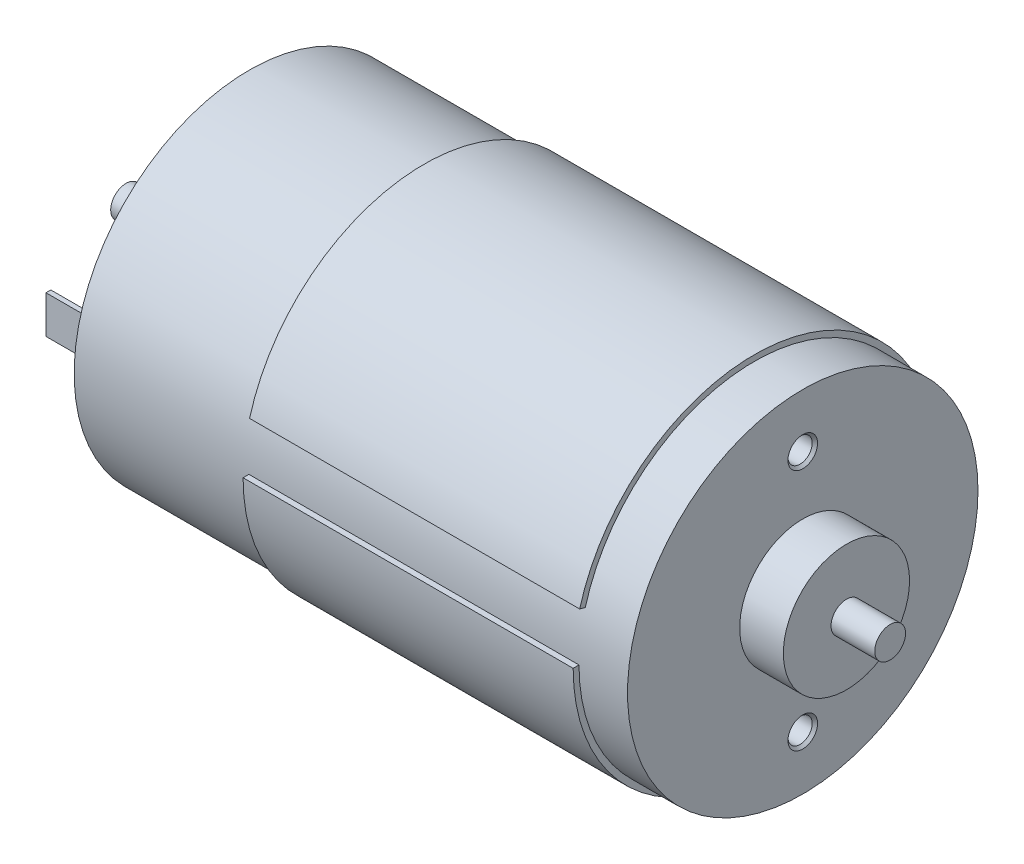
ISO-10303-21;
HEADER;
FILE_DESCRIPTION(('STEP AP214'),'2;1');
FILE_NAME('part.step','',(''),(''),'','','');
FILE_SCHEMA(('AUTOMOTIVE_DESIGN { 1 0 10303 214 1 1 1 1 }'));
ENDSEC;
DATA;
#1=APPLICATION_CONTEXT('core data for automotive mechanical design processes');
#2=APPLICATION_PROTOCOL_DEFINITION('international standard','automotive_design',2000,#1);
#3=PRODUCT_CONTEXT('',#1,'mechanical');
#4=PRODUCT('Part','Part','',(#3));
#5=PRODUCT_RELATED_PRODUCT_CATEGORY('part','',(#4));
#6=PRODUCT_DEFINITION_FORMATION('','',#4);
#7=PRODUCT_DEFINITION_CONTEXT('part definition',#1,'design');
#8=PRODUCT_DEFINITION('design','',#6,#7);
#9=PRODUCT_DEFINITION_SHAPE('','',#8);
#10=(LENGTH_UNIT() NAMED_UNIT(*) SI_UNIT(.MILLI.,.METRE.));
#11=(NAMED_UNIT(*) PLANE_ANGLE_UNIT() SI_UNIT($,.RADIAN.));
#12=(NAMED_UNIT(*) SI_UNIT($,.STERADIAN.) SOLID_ANGLE_UNIT());
#13=UNCERTAINTY_MEASURE_WITH_UNIT(LENGTH_MEASURE(1.E-05),#10,'distance_accuracy_value','');
#14=(GEOMETRIC_REPRESENTATION_CONTEXT(3) GLOBAL_UNCERTAINTY_ASSIGNED_CONTEXT((#13)) GLOBAL_UNIT_ASSIGNED_CONTEXT((#10,
#11,#12)) REPRESENTATION_CONTEXT('',''));
#15=CARTESIAN_POINT('',(0.,0.,0.));
#16=DIRECTION('',(0.,0.,1.));
#17=DIRECTION('',(1.,0.,0.));
#18=AXIS2_PLACEMENT_3D('',#15,#16,#17);
#19=CARTESIAN_POINT('',(66.,0.,0.));
#20=DIRECTION('',(1.,0.,0.));
#21=DIRECTION('',(0.,1.,0.));
#22=AXIS2_PLACEMENT_3D('',#19,#20,#21);
#23=PLANE('',#22);
#24=CARTESIAN_POINT('',(66.,0.,0.));
#25=DIRECTION('',(1.,0.,0.));
#26=DIRECTION('',(0.,0.,-1.));
#27=AXIS2_PLACEMENT_3D('',#24,#25,#26);
#28=CIRCLE('',#27,1.5875);
#29=CARTESIAN_POINT('',(66.,0.,-1.5875));
#30=VERTEX_POINT('',#29);
#31=EDGE_CURVE('E468',#30,#30,#28,.T.);
#32=ORIENTED_EDGE('',*,*,#31,.T.);
#33=EDGE_LOOP('',(#32));
#34=FACE_BOUND('',#33,.T.);
#35=ADVANCED_FACE('F18',(#34),#23,.T.);
#36=CARTESIAN_POINT('',(61.5,0.,0.));
#37=DIRECTION('',(1.,0.,0.));
#38=DIRECTION('',(0.,1.,0.));
#39=AXIS2_PLACEMENT_3D('',#36,#37,#38);
#40=PLANE('',#39);
#41=CARTESIAN_POINT('',(61.5,0.,0.));
#42=DIRECTION('',(1.,0.,0.));
#43=DIRECTION('',(0.,0.,-1.));
#44=AXIS2_PLACEMENT_3D('',#41,#42,#43);
#45=CIRCLE('',#44,1.5875);
#46=CARTESIAN_POINT('',(61.5,0.,-1.5875));
#47=VERTEX_POINT('',#46);
#48=EDGE_CURVE('E478',#47,#47,#45,.T.);
#49=ORIENTED_EDGE('',*,*,#48,.F.);
#50=EDGE_LOOP('',(#49));
#51=FACE_BOUND('',#50,.T.);
#52=CARTESIAN_POINT('',(61.5,0.,0.));
#53=DIRECTION('',(1.,0.,0.));
#54=DIRECTION('',(0.,0.,-1.));
#55=AXIS2_PLACEMENT_3D('',#52,#53,#54);
#56=CIRCLE('',#55,6.5);
#57=CARTESIAN_POINT('',(61.5,0.,-6.5));
#58=VERTEX_POINT('',#57);
#59=EDGE_CURVE('E250',#58,#58,#56,.T.);
#60=ORIENTED_EDGE('',*,*,#59,.T.);
#61=EDGE_LOOP('',(#60));
#62=FACE_BOUND('',#61,.T.);
#63=ADVANCED_FACE('F513',(#51,#62),#40,.T.);
#64=CARTESIAN_POINT('',(57.,0.,0.));
#65=DIRECTION('',(1.,0.,0.));
#66=DIRECTION('',(0.,1.,0.));
#67=AXIS2_PLACEMENT_3D('',#64,#65,#66);
#68=PLANE('',#67);
#69=CARTESIAN_POINT('',(57.,0.,0.));
#70=DIRECTION('',(1.,0.,0.));
#71=DIRECTION('',(0.,0.,-1.));
#72=AXIS2_PLACEMENT_3D('',#69,#70,#71);
#73=CIRCLE('',#72,6.5);
#74=CARTESIAN_POINT('',(57.,0.,-6.5));
#75=VERTEX_POINT('',#74);
#76=EDGE_CURVE('E240',#75,#75,#73,.T.);
#77=ORIENTED_EDGE('',*,*,#76,.F.);
#78=EDGE_LOOP('',(#77));
#79=FACE_BOUND('',#78,.T.);
#80=CARTESIAN_POINT('',(57.,-12.5,0.));
#81=DIRECTION('',(1.,0.,0.));
#82=DIRECTION('',(0.,0.,-1.));
#83=AXIS2_PLACEMENT_3D('',#80,#81,#82);
#84=CIRCLE('',#83,1.525);
#85=CARTESIAN_POINT('',(57.,-12.5,-1.525));
#86=VERTEX_POINT('',#85);
#87=EDGE_CURVE('E461',#86,#86,#84,.T.);
#88=ORIENTED_EDGE('',*,*,#87,.F.);
#89=EDGE_LOOP('',(#88));
#90=FACE_BOUND('',#89,.T.);
#91=CARTESIAN_POINT('',(57.,12.5,0.));
#92=DIRECTION('',(1.,0.,0.));
#93=DIRECTION('',(0.,0.,-1.));
#94=AXIS2_PLACEMENT_3D('',#91,#92,#93);
#95=CIRCLE('',#94,1.525);
#96=CARTESIAN_POINT('',(57.,12.5,-1.525));
#97=VERTEX_POINT('',#96);
#98=EDGE_CURVE('E676',#97,#97,#95,.T.);
#99=ORIENTED_EDGE('',*,*,#98,.F.);
#100=EDGE_LOOP('',(#99));
#101=FACE_BOUND('',#100,.T.);
#102=CARTESIAN_POINT('',(57.,0.,0.));
#103=DIRECTION('',(1.,0.,0.));
#104=DIRECTION('',(0.,0.,-1.));
#105=AXIS2_PLACEMENT_3D('',#102,#103,#104);
#106=CIRCLE('',#105,18.05);
#107=CARTESIAN_POINT('',(57.,0.,-18.05));
#108=VERTEX_POINT('',#107);
#109=EDGE_CURVE('E287',#108,#108,#106,.T.);
#110=ORIENTED_EDGE('',*,*,#109,.T.);
#111=EDGE_LOOP('',(#110));
#112=FACE_BOUND('',#111,.T.);
#113=ADVANCED_FACE('F504',(#79,#90,#101,#112),#68,.T.);
#114=CARTESIAN_POINT('',(52.,0.,0.));
#115=DIRECTION('',(-1.,0.,0.));
#116=DIRECTION('',(0.,0.,1.));
#117=AXIS2_PLACEMENT_3D('',#114,#115,#116);
#118=PLANE('',#117);
#119=CARTESIAN_POINT('',(52.,0.,0.));
#120=DIRECTION('',(1.,0.,0.));
#121=DIRECTION('',(0.,0.,1.));
#122=AXIS2_PLACEMENT_3D('',#119,#120,#121);
#123=CIRCLE('',#122,18.05);
#124=CARTESIAN_POINT('',(52.,0.,18.05));
#125=VERTEX_POINT('',#124);
#126=CARTESIAN_POINT('',(52.,4.79546789149172,17.4013214355023));
#127=VERTEX_POINT('',#126);
#128=EDGE_CURVE('E291',#125,#127,#123,.T.);
#129=ORIENTED_EDGE('',*,*,#128,.F.);
#130=DIRECTION('',(0.,0.,-1.));
#131=VECTOR('',#130,1.);
#132=CARTESIAN_POINT('',(52.,0.,18.05));
#133=LINE('',#132,#131);
#134=CARTESIAN_POINT('',(52.,0.,18.65));
#135=VERTEX_POINT('',#134);
#136=EDGE_CURVE('E28',#135,#125,#133,.T.);
#137=ORIENTED_EDGE('',*,*,#136,.F.);
#138=CARTESIAN_POINT('',(52.,0.,0.));
#139=DIRECTION('',(-1.,0.,0.));
#140=DIRECTION('',(0.,0.,1.));
#141=AXIS2_PLACEMENT_3D('',#138,#139,#140);
#142=CIRCLE('',#141,18.65);
#143=CARTESIAN_POINT('',(52.,4.95487402638895,17.9797587131368));
#144=VERTEX_POINT('',#143);
#145=EDGE_CURVE('E233',#144,#135,#142,.T.);
#146=ORIENTED_EDGE('',*,*,#145,.F.);
#147=DIRECTION('',(0.,0.265676891495387,0.964062129390709));
#148=VECTOR('',#147,1.);
#149=CARTESIAN_POINT('',(52.,4.79546789149172,17.4013214355023));
#150=LINE('',#149,#148);
#151=EDGE_CURVE('E262',#127,#144,#150,.T.);
#152=ORIENTED_EDGE('',*,*,#151,.F.);
#153=EDGE_LOOP('',(#129,#137,#146,#152));
#154=FACE_BOUND('',#153,.T.);
#155=ADVANCED_FACE('F502',(#154),#118,.F.);
#156=CARTESIAN_POINT('',(18.,0.,0.));
#157=DIRECTION('',(-1.,0.,0.));
#158=DIRECTION('',(0.,0.,1.));
#159=AXIS2_PLACEMENT_3D('',#156,#157,#158);
#160=PLANE('',#159);
#161=DIRECTION('',(0.,0.,-1.));
#162=VECTOR('',#161,1.);
#163=CARTESIAN_POINT('',(18.,0.,18.05));
#164=LINE('',#163,#162);
#165=CARTESIAN_POINT('',(18.,0.,18.65));
#166=VERTEX_POINT('',#165);
#167=CARTESIAN_POINT('',(18.,0.,18.05));
#168=VERTEX_POINT('',#167);
#169=EDGE_CURVE('E11',#166,#168,#164,.T.);
#170=ORIENTED_EDGE('',*,*,#169,.T.);
#171=CARTESIAN_POINT('',(18.,0.,0.));
#172=DIRECTION('',(1.,0.,0.));
#173=DIRECTION('',(0.,0.,1.));
#174=AXIS2_PLACEMENT_3D('',#171,#172,#173);
#175=CIRCLE('',#174,18.05);
#176=CARTESIAN_POINT('',(18.,4.79546789149172,17.4013214355023));
#177=VERTEX_POINT('',#176);
#178=EDGE_CURVE('E310',#168,#177,#175,.T.);
#179=ORIENTED_EDGE('',*,*,#178,.T.);
#180=DIRECTION('',(0.,0.265676891495387,0.964062129390709));
#181=VECTOR('',#180,1.);
#182=CARTESIAN_POINT('',(18.,4.79546789149172,17.4013214355023));
#183=LINE('',#182,#181);
#184=CARTESIAN_POINT('',(18.,4.95487402638895,17.9797587131368));
#185=VERTEX_POINT('',#184);
#186=EDGE_CURVE('E21',#177,#185,#183,.T.);
#187=ORIENTED_EDGE('',*,*,#186,.T.);
#188=CARTESIAN_POINT('',(18.,0.,0.));
#189=DIRECTION('',(-1.,0.,0.));
#190=DIRECTION('',(0.,0.,1.));
#191=AXIS2_PLACEMENT_3D('',#188,#189,#190);
#192=CIRCLE('',#191,18.65);
#193=EDGE_CURVE('E43',#185,#166,#192,.T.);
#194=ORIENTED_EDGE('',*,*,#193,.T.);
#195=EDGE_LOOP('',(#170,#179,#187,#194));
#196=FACE_BOUND('',#195,.T.);
#197=ADVANCED_FACE('F237',(#196),#160,.T.);
#198=CARTESIAN_POINT('',(18.,0.,18.05));
#199=DIRECTION('',(0.,-1.,0.));
#200=DIRECTION('',(0.,0.,-1.));
#201=AXIS2_PLACEMENT_3D('',#198,#199,#200);
#202=PLANE('',#201);
#203=ORIENTED_EDGE('',*,*,#136,.T.);
#204=DIRECTION('',(1.,0.,0.));
#205=VECTOR('',#204,1.);
#206=CARTESIAN_POINT('',(18.,0.,18.05));
#207=LINE('',#206,#205);
#208=EDGE_CURVE('E229',#168,#125,#207,.T.);
#209=ORIENTED_EDGE('',*,*,#208,.F.);
#210=ORIENTED_EDGE('',*,*,#169,.F.);
#211=DIRECTION('',(1.,0.,0.));
#212=VECTOR('',#211,1.);
#213=CARTESIAN_POINT('',(18.,0.,18.65));
#214=LINE('',#213,#212);
#215=EDGE_CURVE('E226',#166,#135,#214,.T.);
#216=ORIENTED_EDGE('',*,*,#215,.T.);
#217=EDGE_LOOP('',(#203,#209,#210,#216));
#218=FACE_BOUND('',#217,.T.);
#219=ADVANCED_FACE('F225',(#218),#202,.F.);
#220=CARTESIAN_POINT('',(18.,4.79546789149172,17.4013214355023));
#221=DIRECTION('',(0.,0.964062129390709,-0.265676891495387));
#222=DIRECTION('',(-1.,0.,0.));
#223=AXIS2_PLACEMENT_3D('',#220,#221,#222);
#224=PLANE('',#223);
#225=ORIENTED_EDGE('',*,*,#151,.T.);
#226=DIRECTION('',(1.,0.,0.));
#227=VECTOR('',#226,1.);
#228=CARTESIAN_POINT('',(18.,4.95487402638895,17.9797587131368));
#229=LINE('',#228,#227);
#230=EDGE_CURVE('E411',#185,#144,#229,.T.);
#231=ORIENTED_EDGE('',*,*,#230,.F.);
#232=ORIENTED_EDGE('',*,*,#186,.F.);
#233=DIRECTION('',(1.,0.,0.));
#234=VECTOR('',#233,1.);
#235=CARTESIAN_POINT('',(18.,4.79546789149172,17.4013214355023));
#236=LINE('',#235,#234);
#237=EDGE_CURVE('E302',#177,#127,#236,.T.);
#238=ORIENTED_EDGE('',*,*,#237,.T.);
#239=EDGE_LOOP('',(#225,#231,#232,#238));
#240=FACE_BOUND('',#239,.T.);
#241=ADVANCED_FACE('F500',(#240),#224,.F.);
#242=CARTESIAN_POINT('',(-6.7,0.,0.));
#243=DIRECTION('',(1.,0.,0.));
#244=DIRECTION('',(0.,1.,0.));
#245=AXIS2_PLACEMENT_3D('',#242,#243,#244);
#246=PLANE('',#245);
#247=DIRECTION('',(0.,1.,0.));
#248=VECTOR('',#247,1.);
#249=CARTESIAN_POINT('',(-6.7,-1.95,14.25));
#250=LINE('',#249,#248);
#251=CARTESIAN_POINT('',(-6.7,-1.95,14.25));
#252=VERTEX_POINT('',#251);
#253=CARTESIAN_POINT('',(-6.7,1.95,14.25));
#254=VERTEX_POINT('',#253);
#255=EDGE_CURVE('E372',#252,#254,#250,.T.);
#256=ORIENTED_EDGE('',*,*,#255,.T.);
#257=DIRECTION('',(0.,0.,-1.));
#258=VECTOR('',#257,1.);
#259=CARTESIAN_POINT('',(-6.7,1.95,13.75));
#260=LINE('',#259,#258);
#261=CARTESIAN_POINT('',(-6.7,1.95,13.75));
#262=VERTEX_POINT('',#261);
#263=EDGE_CURVE('E185',#254,#262,#260,.T.);
#264=ORIENTED_EDGE('',*,*,#263,.T.);
#265=DIRECTION('',(0.,-1.,0.));
#266=VECTOR('',#265,1.);
#267=CARTESIAN_POINT('',(-6.7,-1.95,13.75));
#268=LINE('',#267,#266);
#269=CARTESIAN_POINT('',(-6.7,-1.95,13.75));
#270=VERTEX_POINT('',#269);
#271=EDGE_CURVE('E263',#262,#270,#268,.T.);
#272=ORIENTED_EDGE('',*,*,#271,.T.);
#273=DIRECTION('',(0.,0.,1.));
#274=VECTOR('',#273,1.);
#275=CARTESIAN_POINT('',(-6.7,-1.95,13.75));
#276=LINE('',#275,#274);
#277=EDGE_CURVE('E196',#270,#252,#276,.T.);
#278=ORIENTED_EDGE('',*,*,#277,.T.);
#279=EDGE_LOOP('',(#256,#264,#272,#278));
#280=FACE_BOUND('',#279,.T.);
#281=ADVANCED_FACE('F639',(#280),#246,.F.);
#282=CARTESIAN_POINT('',(-6.7,-1.95,13.75));
#283=DIRECTION('',(0.,1.,0.));
#284=DIRECTION('',(1.,0.,0.));
#285=AXIS2_PLACEMENT_3D('',#282,#283,#284);
#286=PLANE('',#285);
#287=DIRECTION('',(0.,0.,1.));
#288=VECTOR('',#287,1.);
#289=CARTESIAN_POINT('',(0.3,-1.95,13.75));
#290=LINE('',#289,#288);
#291=CARTESIAN_POINT('',(0.3,-1.95,13.75));
#292=VERTEX_POINT('',#291);
#293=CARTESIAN_POINT('',(0.3,-1.95,14.25));
#294=VERTEX_POINT('',#293);
#295=EDGE_CURVE('E272',#292,#294,#290,.T.);
#296=ORIENTED_EDGE('',*,*,#295,.T.);
#297=DIRECTION('',(1.,0.,0.));
#298=VECTOR('',#297,1.);
#299=CARTESIAN_POINT('',(-6.7,-1.95,14.25));
#300=LINE('',#299,#298);
#301=EDGE_CURVE('E341',#252,#294,#300,.T.);
#302=ORIENTED_EDGE('',*,*,#301,.F.);
#303=ORIENTED_EDGE('',*,*,#277,.F.);
#304=DIRECTION('',(1.,0.,0.));
#305=VECTOR('',#304,1.);
#306=CARTESIAN_POINT('',(-6.7,-1.95,13.75));
#307=LINE('',#306,#305);
#308=EDGE_CURVE('E305',#270,#292,#307,.T.);
#309=ORIENTED_EDGE('',*,*,#308,.T.);
#310=EDGE_LOOP('',(#296,#302,#303,#309));
#311=FACE_BOUND('',#310,.T.);
#312=ADVANCED_FACE('F636',(#311),#286,.F.);
#313=CARTESIAN_POINT('',(-6.7,-1.95,13.75));
#314=DIRECTION('',(0.,0.,1.));
#315=DIRECTION('',(1.,0.,0.));
#316=AXIS2_PLACEMENT_3D('',#313,#314,#315);
#317=PLANE('',#316);
#318=DIRECTION('',(0.,-1.,0.));
#319=VECTOR('',#318,1.);
#320=CARTESIAN_POINT('',(0.3,-1.95,13.75));
#321=LINE('',#320,#319);
#322=CARTESIAN_POINT('',(0.3,1.95,13.75));
#323=VERTEX_POINT('',#322);
#324=EDGE_CURVE('E267',#323,#292,#321,.T.);
#325=ORIENTED_EDGE('',*,*,#324,.T.);
#326=ORIENTED_EDGE('',*,*,#308,.F.);
#327=ORIENTED_EDGE('',*,*,#271,.F.);
#328=DIRECTION('',(1.,0.,0.));
#329=VECTOR('',#328,1.);
#330=CARTESIAN_POINT('',(-6.7,1.95,13.75));
#331=LINE('',#330,#329);
#332=EDGE_CURVE('E306',#262,#323,#331,.T.);
#333=ORIENTED_EDGE('',*,*,#332,.T.);
#334=EDGE_LOOP('',(#325,#326,#327,#333));
#335=FACE_BOUND('',#334,.T.);
#336=ADVANCED_FACE('F633',(#335),#317,.F.);
#337=CARTESIAN_POINT('',(-6.7,1.95,13.75));
#338=DIRECTION('',(0.,-1.,0.));
#339=DIRECTION('',(0.,0.,-1.));
#340=AXIS2_PLACEMENT_3D('',#337,#338,#339);
#341=PLANE('',#340);
#342=DIRECTION('',(0.,0.,-1.));
#343=VECTOR('',#342,1.);
#344=CARTESIAN_POINT('',(0.3,1.95,13.75));
#345=LINE('',#344,#343);
#346=CARTESIAN_POINT('',(0.3,1.95,14.25));
#347=VERTEX_POINT('',#346);
#348=EDGE_CURVE('E271',#347,#323,#345,.T.);
#349=ORIENTED_EDGE('',*,*,#348,.T.);
#350=ORIENTED_EDGE('',*,*,#332,.F.);
#351=ORIENTED_EDGE('',*,*,#263,.F.);
#352=DIRECTION('',(1.,0.,0.));
#353=VECTOR('',#352,1.);
#354=CARTESIAN_POINT('',(-6.7,1.95,14.25));
#355=LINE('',#354,#353);
#356=EDGE_CURVE('E326',#254,#347,#355,.T.);
#357=ORIENTED_EDGE('',*,*,#356,.T.);
#358=EDGE_LOOP('',(#349,#350,#351,#357));
#359=FACE_BOUND('',#358,.T.);
#360=ADVANCED_FACE('F615',(#359),#341,.F.);
#361=CARTESIAN_POINT('',(-6.7,-1.95,14.25));
#362=DIRECTION('',(0.,0.,-1.));
#363=DIRECTION('',(0.,-1.,0.));
#364=AXIS2_PLACEMENT_3D('',#361,#362,#363);
#365=PLANE('',#364);
#366=DIRECTION('',(0.,1.,0.));
#367=VECTOR('',#366,1.);
#368=CARTESIAN_POINT('',(0.3,-1.95,14.25));
#369=LINE('',#368,#367);
#370=EDGE_CURVE('E355',#294,#347,#369,.T.);
#371=ORIENTED_EDGE('',*,*,#370,.T.);
#372=ORIENTED_EDGE('',*,*,#356,.F.);
#373=ORIENTED_EDGE('',*,*,#255,.F.);
#374=ORIENTED_EDGE('',*,*,#301,.T.);
#375=EDGE_LOOP('',(#371,#372,#373,#374));
#376=FACE_BOUND('',#375,.T.);
#377=ADVANCED_FACE('F611',(#376),#365,.F.);
#378=CARTESIAN_POINT('',(-6.7,0.,0.));
#379=DIRECTION('',(1.,0.,0.));
#380=DIRECTION('',(0.,1.,0.));
#381=AXIS2_PLACEMENT_3D('',#378,#379,#380);
#382=PLANE('',#381);
#383=DIRECTION('',(0.,1.,0.));
#384=VECTOR('',#383,1.);
#385=CARTESIAN_POINT('',(-6.7,-1.95,-13.75));
#386=LINE('',#385,#384);
#387=CARTESIAN_POINT('',(-6.7,-1.95,-13.75));
#388=VERTEX_POINT('',#387);
#389=CARTESIAN_POINT('',(-6.7,1.95,-13.75));
#390=VERTEX_POINT('',#389);
#391=EDGE_CURVE('E426',#388,#390,#386,.T.);
#392=ORIENTED_EDGE('',*,*,#391,.T.);
#393=DIRECTION('',(0.,0.,-1.));
#394=VECTOR('',#393,1.);
#395=CARTESIAN_POINT('',(-6.7,1.95,-14.25));
#396=LINE('',#395,#394);
#397=CARTESIAN_POINT('',(-6.7,1.95,-14.25));
#398=VERTEX_POINT('',#397);
#399=EDGE_CURVE('E436',#390,#398,#396,.T.);
#400=ORIENTED_EDGE('',*,*,#399,.T.);
#401=DIRECTION('',(0.,-1.,0.));
#402=VECTOR('',#401,1.);
#403=CARTESIAN_POINT('',(-6.7,-1.95,-14.25));
#404=LINE('',#403,#402);
#405=CARTESIAN_POINT('',(-6.7,-1.95,-14.25));
#406=VERTEX_POINT('',#405);
#407=EDGE_CURVE('E327',#398,#406,#404,.T.);
#408=ORIENTED_EDGE('',*,*,#407,.T.);
#409=DIRECTION('',(0.,0.,1.));
#410=VECTOR('',#409,1.);
#411=CARTESIAN_POINT('',(-6.7,-1.95,-14.25));
#412=LINE('',#411,#410);
#413=EDGE_CURVE('E323',#406,#388,#412,.T.);
#414=ORIENTED_EDGE('',*,*,#413,.T.);
#415=EDGE_LOOP('',(#392,#400,#408,#414));
#416=FACE_BOUND('',#415,.T.);
#417=ADVANCED_FACE('F614',(#416),#382,.F.);
#418=CARTESIAN_POINT('',(-6.7,-1.95,-14.25));
#419=DIRECTION('',(0.,1.,0.));
#420=DIRECTION('',(1.,0.,0.));
#421=AXIS2_PLACEMENT_3D('',#418,#419,#420);
#422=PLANE('',#421);
#423=DIRECTION('',(0.,0.,1.));
#424=VECTOR('',#423,1.);
#425=CARTESIAN_POINT('',(0.3,-1.95,-14.25));
#426=LINE('',#425,#424);
#427=CARTESIAN_POINT('',(0.3,-1.95,-14.25));
#428=VERTEX_POINT('',#427);
#429=CARTESIAN_POINT('',(0.3,-1.95,-13.75));
#430=VERTEX_POINT('',#429);
#431=EDGE_CURVE('E317',#428,#430,#426,.T.);
#432=ORIENTED_EDGE('',*,*,#431,.T.);
#433=DIRECTION('',(1.,0.,0.));
#434=VECTOR('',#433,1.);
#435=CARTESIAN_POINT('',(-6.7,-1.95,-13.75));
#436=LINE('',#435,#434);
#437=EDGE_CURVE('E430',#388,#430,#436,.T.);
#438=ORIENTED_EDGE('',*,*,#437,.F.);
#439=ORIENTED_EDGE('',*,*,#413,.F.);
#440=DIRECTION('',(1.,0.,0.));
#441=VECTOR('',#440,1.);
#442=CARTESIAN_POINT('',(-6.7,-1.95,-14.25));
#443=LINE('',#442,#441);
#444=EDGE_CURVE('E345',#406,#428,#443,.T.);
#445=ORIENTED_EDGE('',*,*,#444,.T.);
#446=EDGE_LOOP('',(#432,#438,#439,#445));
#447=FACE_BOUND('',#446,.T.);
#448=ADVANCED_FACE('F623',(#447),#422,.F.);
#449=CARTESIAN_POINT('',(-6.7,-1.95,-14.25));
#450=DIRECTION('',(0.,0.,1.));
#451=DIRECTION('',(1.,0.,0.));
#452=AXIS2_PLACEMENT_3D('',#449,#450,#451);
#453=PLANE('',#452);
#454=DIRECTION('',(0.,-1.,0.));
#455=VECTOR('',#454,1.);
#456=CARTESIAN_POINT('',(0.3,-1.95,-14.25));
#457=LINE('',#456,#455);
#458=CARTESIAN_POINT('',(0.3,1.95,-14.25));
#459=VERTEX_POINT('',#458);
#460=EDGE_CURVE('E298',#459,#428,#457,.T.);
#461=ORIENTED_EDGE('',*,*,#460,.T.);
#462=ORIENTED_EDGE('',*,*,#444,.F.);
#463=ORIENTED_EDGE('',*,*,#407,.F.);
#464=DIRECTION('',(1.,0.,0.));
#465=VECTOR('',#464,1.);
#466=CARTESIAN_POINT('',(-6.7,1.95,-14.25));
#467=LINE('',#466,#465);
#468=EDGE_CURVE('E433',#398,#459,#467,.T.);
#469=ORIENTED_EDGE('',*,*,#468,.T.);
#470=EDGE_LOOP('',(#461,#462,#463,#469));
#471=FACE_BOUND('',#470,.T.);
#472=ADVANCED_FACE('F619',(#471),#453,.F.);
#473=CARTESIAN_POINT('',(-6.7,1.95,-14.25));
#474=DIRECTION('',(0.,-1.,0.));
#475=DIRECTION('',(0.,0.,-1.));
#476=AXIS2_PLACEMENT_3D('',#473,#474,#475);
#477=PLANE('',#476);
#478=DIRECTION('',(0.,0.,-1.));
#479=VECTOR('',#478,1.);
#480=CARTESIAN_POINT('',(0.3,1.95,-14.25));
#481=LINE('',#480,#479);
#482=CARTESIAN_POINT('',(0.3,1.95,-13.75));
#483=VERTEX_POINT('',#482);
#484=EDGE_CURVE('E293',#483,#459,#481,.T.);
#485=ORIENTED_EDGE('',*,*,#484,.T.);
#486=ORIENTED_EDGE('',*,*,#468,.F.);
#487=ORIENTED_EDGE('',*,*,#399,.F.);
#488=DIRECTION('',(1.,0.,0.));
#489=VECTOR('',#488,1.);
#490=CARTESIAN_POINT('',(-6.7,1.95,-13.75));
#491=LINE('',#490,#489);
#492=EDGE_CURVE('E423',#390,#483,#491,.T.);
#493=ORIENTED_EDGE('',*,*,#492,.T.);
#494=EDGE_LOOP('',(#485,#486,#487,#493));
#495=FACE_BOUND('',#494,.T.);
#496=ADVANCED_FACE('F609',(#495),#477,.F.);
#497=CARTESIAN_POINT('',(-6.7,-1.95,-13.75));
#498=DIRECTION('',(0.,0.,-1.));
#499=DIRECTION('',(0.,-1.,0.));
#500=AXIS2_PLACEMENT_3D('',#497,#498,#499);
#501=PLANE('',#500);
#502=DIRECTION('',(0.,1.,0.));
#503=VECTOR('',#502,1.);
#504=CARTESIAN_POINT('',(0.3,-1.95,-13.75));
#505=LINE('',#504,#503);
#506=EDGE_CURVE('E383',#430,#483,#505,.T.);
#507=ORIENTED_EDGE('',*,*,#506,.T.);
#508=ORIENTED_EDGE('',*,*,#492,.F.);
#509=ORIENTED_EDGE('',*,*,#391,.F.);
#510=ORIENTED_EDGE('',*,*,#437,.T.);
#511=EDGE_LOOP('',(#507,#508,#509,#510));
#512=FACE_BOUND('',#511,.T.);
#513=ADVANCED_FACE('F606',(#512),#501,.F.);
#514=CARTESIAN_POINT('',(0.3,-3.075,12.575));
#515=DIRECTION('',(0.,1.,0.));
#516=DIRECTION('',(1.,0.,0.));
#517=AXIS2_PLACEMENT_3D('',#514,#515,#516);
#518=PLANE('',#517);
#519=DIRECTION('',(0.,0.,1.));
#520=VECTOR('',#519,1.);
#521=CARTESIAN_POINT('',(1.3,-3.075,12.575));
#522=LINE('',#521,#520);
#523=CARTESIAN_POINT('',(1.3,-3.075,12.575));
#524=VERTEX_POINT('',#523);
#525=CARTESIAN_POINT('',(1.3,-3.075,15.425));
#526=VERTEX_POINT('',#525);
#527=EDGE_CURVE('E351',#524,#526,#522,.T.);
#528=ORIENTED_EDGE('',*,*,#527,.T.);
#529=DIRECTION('',(1.,0.,0.));
#530=VECTOR('',#529,1.);
#531=CARTESIAN_POINT('',(0.3,-3.075,15.425));
#532=LINE('',#531,#530);
#533=CARTESIAN_POINT('',(0.3,-3.075,15.425));
#534=VERTEX_POINT('',#533);
#535=EDGE_CURVE('E330',#534,#526,#532,.T.);
#536=ORIENTED_EDGE('',*,*,#535,.F.);
#537=DIRECTION('',(0.,0.,1.));
#538=VECTOR('',#537,1.);
#539=CARTESIAN_POINT('',(0.3,-3.075,12.575));
#540=LINE('',#539,#538);
#541=CARTESIAN_POINT('',(0.3,-3.075,12.575));
#542=VERTEX_POINT('',#541);
#543=EDGE_CURVE('E338',#542,#534,#540,.T.);
#544=ORIENTED_EDGE('',*,*,#543,.F.);
#545=DIRECTION('',(1.,0.,0.));
#546=VECTOR('',#545,1.);
#547=CARTESIAN_POINT('',(0.3,-3.075,12.575));
#548=LINE('',#547,#546);
#549=EDGE_CURVE('E420',#542,#524,#548,.T.);
#550=ORIENTED_EDGE('',*,*,#549,.T.);
#551=EDGE_LOOP('',(#528,#536,#544,#550));
#552=FACE_BOUND('',#551,.T.);
#553=ADVANCED_FACE('F586',(#552),#518,.F.);
#554=CARTESIAN_POINT('',(0.3,-3.075,12.575));
#555=DIRECTION('',(0.,0.,1.));
#556=DIRECTION('',(1.,0.,0.));
#557=AXIS2_PLACEMENT_3D('',#554,#555,#556);
#558=PLANE('',#557);
#559=DIRECTION('',(0.,-1.,0.));
#560=VECTOR('',#559,1.);
#561=CARTESIAN_POINT('',(1.3,-3.075,12.575));
#562=LINE('',#561,#560);
#563=CARTESIAN_POINT('',(1.3,3.075,12.575));
#564=VERTEX_POINT('',#563);
#565=EDGE_CURVE('E346',#564,#524,#562,.T.);
#566=ORIENTED_EDGE('',*,*,#565,.T.);
#567=ORIENTED_EDGE('',*,*,#549,.F.);
#568=DIRECTION('',(0.,-1.,0.));
#569=VECTOR('',#568,1.);
#570=CARTESIAN_POINT('',(0.3,-3.075,12.575));
#571=LINE('',#570,#569);
#572=CARTESIAN_POINT('',(0.3,3.075,12.575));
#573=VERTEX_POINT('',#572);
#574=EDGE_CURVE('E334',#573,#542,#571,.T.);
#575=ORIENTED_EDGE('',*,*,#574,.F.);
#576=DIRECTION('',(1.,0.,0.));
#577=VECTOR('',#576,1.);
#578=CARTESIAN_POINT('',(0.3,3.075,12.575));
#579=LINE('',#578,#577);
#580=EDGE_CURVE('E416',#573,#564,#579,.T.);
#581=ORIENTED_EDGE('',*,*,#580,.T.);
#582=EDGE_LOOP('',(#566,#567,#575,#581));
#583=FACE_BOUND('',#582,.T.);
#584=ADVANCED_FACE('F582',(#583),#558,.F.);
#585=CARTESIAN_POINT('',(0.3,3.075,12.575));
#586=DIRECTION('',(0.,-1.,0.));
#587=DIRECTION('',(0.,0.,-1.));
#588=AXIS2_PLACEMENT_3D('',#585,#586,#587);
#589=PLANE('',#588);
#590=DIRECTION('',(0.,0.,-1.));
#591=VECTOR('',#590,1.);
#592=CARTESIAN_POINT('',(1.3,3.075,12.575));
#593=LINE('',#592,#591);
#594=CARTESIAN_POINT('',(1.3,3.075,15.425));
#595=VERTEX_POINT('',#594);
#596=EDGE_CURVE('E367',#595,#564,#593,.T.);
#597=ORIENTED_EDGE('',*,*,#596,.T.);
#598=ORIENTED_EDGE('',*,*,#580,.F.);
#599=DIRECTION('',(0.,0.,-1.));
#600=VECTOR('',#599,1.);
#601=CARTESIAN_POINT('',(0.3,3.075,12.575));
#602=LINE('',#601,#600);
#603=CARTESIAN_POINT('',(0.3,3.075,15.425));
#604=VERTEX_POINT('',#603);
#605=EDGE_CURVE('E258',#604,#573,#602,.T.);
#606=ORIENTED_EDGE('',*,*,#605,.F.);
#607=DIRECTION('',(1.,0.,0.));
#608=VECTOR('',#607,1.);
#609=CARTESIAN_POINT('',(0.3,3.075,15.425));
#610=LINE('',#609,#608);
#611=EDGE_CURVE('E276',#604,#595,#610,.T.);
#612=ORIENTED_EDGE('',*,*,#611,.T.);
#613=EDGE_LOOP('',(#597,#598,#606,#612));
#614=FACE_BOUND('',#613,.T.);
#615=ADVANCED_FACE('F585',(#614),#589,.F.);
#616=CARTESIAN_POINT('',(0.3,-3.075,15.425));
#617=DIRECTION('',(0.,0.,-1.));
#618=DIRECTION('',(0.,-1.,0.));
#619=AXIS2_PLACEMENT_3D('',#616,#617,#618);
#620=PLANE('',#619);
#621=DIRECTION('',(0.,1.,0.));
#622=VECTOR('',#621,1.);
#623=CARTESIAN_POINT('',(1.3,-3.075,15.425));
#624=LINE('',#623,#622);
#625=EDGE_CURVE('E363',#526,#595,#624,.T.);
#626=ORIENTED_EDGE('',*,*,#625,.T.);
#627=ORIENTED_EDGE('',*,*,#611,.F.);
#628=DIRECTION('',(0.,1.,0.));
#629=VECTOR('',#628,1.);
#630=CARTESIAN_POINT('',(0.3,-3.075,15.425));
#631=LINE('',#630,#629);
#632=EDGE_CURVE('E255',#534,#604,#631,.T.);
#633=ORIENTED_EDGE('',*,*,#632,.F.);
#634=ORIENTED_EDGE('',*,*,#535,.T.);
#635=EDGE_LOOP('',(#626,#627,#633,#634));
#636=FACE_BOUND('',#635,.T.);
#637=ADVANCED_FACE('F598',(#636),#620,.F.);
#638=CARTESIAN_POINT('',(0.3,-3.075,-15.425));
#639=DIRECTION('',(0.,1.,0.));
#640=DIRECTION('',(1.,0.,0.));
#641=AXIS2_PLACEMENT_3D('',#638,#639,#640);
#642=PLANE('',#641);
#643=DIRECTION('',(0.,0.,1.));
#644=VECTOR('',#643,1.);
#645=CARTESIAN_POINT('',(1.3,-3.075,-15.425));
#646=LINE('',#645,#644);
#647=CARTESIAN_POINT('',(1.3,-3.075,-15.425));
#648=VERTEX_POINT('',#647);
#649=CARTESIAN_POINT('',(1.3,-3.075,-12.575));
#650=VERTEX_POINT('',#649);
#651=EDGE_CURVE('E391',#648,#650,#646,.T.);
#652=ORIENTED_EDGE('',*,*,#651,.T.);
#653=DIRECTION('',(1.,0.,0.));
#654=VECTOR('',#653,1.);
#655=CARTESIAN_POINT('',(0.3,-3.075,-12.575));
#656=LINE('',#655,#654);
#657=CARTESIAN_POINT('',(0.3,-3.075,-12.575));
#658=VERTEX_POINT('',#657);
#659=EDGE_CURVE('E405',#658,#650,#656,.T.);
#660=ORIENTED_EDGE('',*,*,#659,.F.);
#661=DIRECTION('',(0.,0.,1.));
#662=VECTOR('',#661,1.);
#663=CARTESIAN_POINT('',(0.3,-3.075,-15.425));
#664=LINE('',#663,#662);
#665=CARTESIAN_POINT('',(0.3,-3.075,-15.425));
#666=VERTEX_POINT('',#665);
#667=EDGE_CURVE('E379',#666,#658,#664,.T.);
#668=ORIENTED_EDGE('',*,*,#667,.F.);
#669=DIRECTION('',(1.,0.,0.));
#670=VECTOR('',#669,1.);
#671=CARTESIAN_POINT('',(0.3,-3.075,-15.425));
#672=LINE('',#671,#670);
#673=EDGE_CURVE('E273',#666,#648,#672,.T.);
#674=ORIENTED_EDGE('',*,*,#673,.T.);
#675=EDGE_LOOP('',(#652,#660,#668,#674));
#676=FACE_BOUND('',#675,.T.);
#677=ADVANCED_FACE('F594',(#676),#642,.F.);
#678=CARTESIAN_POINT('',(0.3,-3.075,-15.425));
#679=DIRECTION('',(0.,0.,1.));
#680=DIRECTION('',(1.,0.,0.));
#681=AXIS2_PLACEMENT_3D('',#678,#679,#680);
#682=PLANE('',#681);
#683=DIRECTION('',(0.,-1.,0.));
#684=VECTOR('',#683,1.);
#685=CARTESIAN_POINT('',(1.3,-3.075,-15.425));
#686=LINE('',#685,#684);
#687=CARTESIAN_POINT('',(1.3,3.075,-15.425));
#688=VERTEX_POINT('',#687);
#689=EDGE_CURVE('E395',#688,#648,#686,.T.);
#690=ORIENTED_EDGE('',*,*,#689,.T.);
#691=ORIENTED_EDGE('',*,*,#673,.F.);
#692=DIRECTION('',(0.,-1.,0.));
#693=VECTOR('',#692,1.);
#694=CARTESIAN_POINT('',(0.3,-3.075,-15.425));
#695=LINE('',#694,#693);
#696=CARTESIAN_POINT('',(0.3,3.075,-15.425));
#697=VERTEX_POINT('',#696);
#698=EDGE_CURVE('E378',#697,#666,#695,.T.);
#699=ORIENTED_EDGE('',*,*,#698,.F.);
#700=DIRECTION('',(1.,0.,0.));
#701=VECTOR('',#700,1.);
#702=CARTESIAN_POINT('',(0.3,3.075,-15.425));
#703=LINE('',#702,#701);
#704=EDGE_CURVE('E277',#697,#688,#703,.T.);
#705=ORIENTED_EDGE('',*,*,#704,.T.);
#706=EDGE_LOOP('',(#690,#691,#699,#705));
#707=FACE_BOUND('',#706,.T.);
#708=ADVANCED_FACE('F590',(#707),#682,.F.);
#709=CARTESIAN_POINT('',(0.3,3.075,-15.425));
#710=DIRECTION('',(0.,-1.,0.));
#711=DIRECTION('',(0.,0.,-1.));
#712=AXIS2_PLACEMENT_3D('',#709,#710,#711);
#713=PLANE('',#712);
#714=DIRECTION('',(0.,0.,-1.));
#715=VECTOR('',#714,1.);
#716=CARTESIAN_POINT('',(1.3,3.075,-15.425));
#717=LINE('',#716,#715);
#718=CARTESIAN_POINT('',(1.3,3.075,-12.575));
#719=VERTEX_POINT('',#718);
#720=EDGE_CURVE('E297',#719,#688,#717,.T.);
#721=ORIENTED_EDGE('',*,*,#720,.T.);
#722=ORIENTED_EDGE('',*,*,#704,.F.);
#723=DIRECTION('',(0.,0.,-1.));
#724=VECTOR('',#723,1.);
#725=CARTESIAN_POINT('',(0.3,3.075,-15.425));
#726=LINE('',#725,#724);
#727=CARTESIAN_POINT('',(0.3,3.075,-12.575));
#728=VERTEX_POINT('',#727);
#729=EDGE_CURVE('E371',#728,#697,#726,.T.);
#730=ORIENTED_EDGE('',*,*,#729,.F.);
#731=DIRECTION('',(1.,0.,0.));
#732=VECTOR('',#731,1.);
#733=CARTESIAN_POINT('',(0.3,3.075,-12.575));
#734=LINE('',#733,#732);
#735=EDGE_CURVE('E350',#728,#719,#734,.T.);
#736=ORIENTED_EDGE('',*,*,#735,.T.);
#737=EDGE_LOOP('',(#721,#722,#730,#736));
#738=FACE_BOUND('',#737,.T.);
#739=ADVANCED_FACE('F580',(#738),#713,.F.);
#740=CARTESIAN_POINT('',(0.3,-3.075,-12.575));
#741=DIRECTION('',(0.,0.,-1.));
#742=DIRECTION('',(0.,-1.,0.));
#743=AXIS2_PLACEMENT_3D('',#740,#741,#742);
#744=PLANE('',#743);
#745=DIRECTION('',(0.,1.,0.));
#746=VECTOR('',#745,1.);
#747=CARTESIAN_POINT('',(1.3,-3.075,-12.575));
#748=LINE('',#747,#746);
#749=EDGE_CURVE('E387',#650,#719,#748,.T.);
#750=ORIENTED_EDGE('',*,*,#749,.T.);
#751=ORIENTED_EDGE('',*,*,#735,.F.);
#752=DIRECTION('',(0.,1.,0.));
#753=VECTOR('',#752,1.);
#754=CARTESIAN_POINT('',(0.3,-3.075,-12.575));
#755=LINE('',#754,#753);
#756=EDGE_CURVE('E362',#658,#728,#755,.T.);
#757=ORIENTED_EDGE('',*,*,#756,.F.);
#758=ORIENTED_EDGE('',*,*,#659,.T.);
#759=EDGE_LOOP('',(#750,#751,#757,#758));
#760=FACE_BOUND('',#759,.T.);
#761=ADVANCED_FACE('F576',(#760),#744,.F.);
#762=CARTESIAN_POINT('',(-12.7,0.,0.));
#763=DIRECTION('',(-1.,0.,0.));
#764=DIRECTION('',(0.,0.,1.));
#765=AXIS2_PLACEMENT_3D('',#762,#763,#764);
#766=PLANE('',#765);
#767=CARTESIAN_POINT('',(-12.7,0.,0.));
#768=DIRECTION('',(-1.,0.,0.));
#769=DIRECTION('',(0.,0.,1.));
#770=AXIS2_PLACEMENT_3D('',#767,#768,#769);
#771=CIRCLE('',#770,1.5875);
#772=CARTESIAN_POINT('',(-12.7,0.,1.5875));
#773=VERTEX_POINT('',#772);
#774=EDGE_CURVE('E235',#773,#773,#771,.T.);
#775=ORIENTED_EDGE('',*,*,#774,.T.);
#776=EDGE_LOOP('',(#775));
#777=FACE_BOUND('',#776,.T.);
#778=ADVANCED_FACE('F571',(#777),#766,.T.);
#779=CARTESIAN_POINT('',(-2.7,0.,0.));
#780=DIRECTION('',(-1.,0.,0.));
#781=DIRECTION('',(0.,0.,1.));
#782=AXIS2_PLACEMENT_3D('',#779,#780,#781);
#783=PLANE('',#782);
#784=CARTESIAN_POINT('',(-2.7,0.,0.));
#785=DIRECTION('',(-1.,0.,0.));
#786=DIRECTION('',(0.,0.,1.));
#787=AXIS2_PLACEMENT_3D('',#784,#785,#786);
#788=CIRCLE('',#787,1.5875);
#789=CARTESIAN_POINT('',(-2.7,0.,1.5875));
#790=VERTEX_POINT('',#789);
#791=EDGE_CURVE('E254',#790,#790,#788,.T.);
#792=ORIENTED_EDGE('',*,*,#791,.F.);
#793=EDGE_LOOP('',(#792));
#794=FACE_BOUND('',#793,.T.);
#795=CARTESIAN_POINT('',(-2.7,0.,0.));
#796=DIRECTION('',(-1.,0.,0.));
#797=DIRECTION('',(0.,0.,1.));
#798=AXIS2_PLACEMENT_3D('',#795,#796,#797);
#799=CIRCLE('',#798,6.45);
#800=CARTESIAN_POINT('',(-2.7,0.,6.45));
#801=VERTEX_POINT('',#800);
#802=EDGE_CURVE('E278',#801,#801,#799,.T.);
#803=ORIENTED_EDGE('',*,*,#802,.T.);
#804=EDGE_LOOP('',(#803));
#805=FACE_BOUND('',#804,.T.);
#806=ADVANCED_FACE('F568',(#794,#805),#783,.T.);
#807=CARTESIAN_POINT('',(0.,0.,0.));
#808=DIRECTION('',(1.,0.,0.));
#809=DIRECTION('',(0.,1.,0.));
#810=AXIS2_PLACEMENT_3D('',#807,#808,#809);
#811=PLANE('',#810);
#812=CARTESIAN_POINT('',(0.,0.,0.));
#813=DIRECTION('',(-1.,0.,0.));
#814=DIRECTION('',(0.,0.,1.));
#815=AXIS2_PLACEMENT_3D('',#812,#813,#814);
#816=CIRCLE('',#815,17.35);
#817=CARTESIAN_POINT('',(0.,0.,17.35));
#818=VERTEX_POINT('',#817);
#819=EDGE_CURVE('E292',#818,#818,#816,.T.);
#820=ORIENTED_EDGE('',*,*,#819,.F.);
#821=EDGE_LOOP('',(#820));
#822=FACE_BOUND('',#821,.T.);
#823=CARTESIAN_POINT('',(0.,0.,0.));
#824=DIRECTION('',(1.,0.,0.));
#825=DIRECTION('',(0.,0.,-1.));
#826=AXIS2_PLACEMENT_3D('',#823,#824,#825);
#827=CIRCLE('',#826,18.05);
#828=CARTESIAN_POINT('',(0.,0.,-18.05));
#829=VERTEX_POINT('',#828);
#830=EDGE_CURVE('E313',#829,#829,#827,.T.);
#831=ORIENTED_EDGE('',*,*,#830,.F.);
#832=EDGE_LOOP('',(#831));
#833=FACE_BOUND('',#832,.T.);
#834=ADVANCED_FACE('F564',(#822,#833),#811,.F.);
#835=CARTESIAN_POINT('',(1.3,0.,0.));
#836=DIRECTION('',(-1.,0.,0.));
#837=DIRECTION('',(0.,0.,1.));
#838=AXIS2_PLACEMENT_3D('',#835,#836,#837);
#839=PLANE('',#838);
#840=ORIENTED_EDGE('',*,*,#596,.F.);
#841=ORIENTED_EDGE('',*,*,#625,.F.);
#842=ORIENTED_EDGE('',*,*,#527,.F.);
#843=ORIENTED_EDGE('',*,*,#565,.F.);
#844=EDGE_LOOP('',(#840,#841,#842,#843));
#845=FACE_BOUND('',#844,.T.);
#846=ORIENTED_EDGE('',*,*,#720,.F.);
#847=ORIENTED_EDGE('',*,*,#749,.F.);
#848=ORIENTED_EDGE('',*,*,#651,.F.);
#849=ORIENTED_EDGE('',*,*,#689,.F.);
#850=EDGE_LOOP('',(#846,#847,#848,#849));
#851=FACE_BOUND('',#850,.T.);
#852=CARTESIAN_POINT('',(1.3,0.,0.));
#853=DIRECTION('',(-1.,0.,0.));
#854=DIRECTION('',(0.,0.,1.));
#855=AXIS2_PLACEMENT_3D('',#852,#853,#854);
#856=CIRCLE('',#855,6.45);
#857=CARTESIAN_POINT('',(1.3,0.,6.45));
#858=VERTEX_POINT('',#857);
#859=EDGE_CURVE('E282',#858,#858,#856,.T.);
#860=ORIENTED_EDGE('',*,*,#859,.F.);
#861=EDGE_LOOP('',(#860));
#862=FACE_BOUND('',#861,.T.);
#863=CARTESIAN_POINT('',(1.3,0.,0.));
#864=DIRECTION('',(-1.,0.,0.));
#865=DIRECTION('',(0.,0.,1.));
#866=AXIS2_PLACEMENT_3D('',#863,#864,#865);
#867=CIRCLE('',#866,17.35);
#868=CARTESIAN_POINT('',(1.3,0.,17.35));
#869=VERTEX_POINT('',#868);
#870=EDGE_CURVE('E285',#869,#869,#867,.T.);
#871=ORIENTED_EDGE('',*,*,#870,.T.);
#872=EDGE_LOOP('',(#871));
#873=FACE_BOUND('',#872,.T.);
#874=ADVANCED_FACE('F560',(#845,#851,#862,#873),#839,.T.);
#875=CARTESIAN_POINT('',(0.3,0.,0.));
#876=DIRECTION('',(1.,0.,0.));
#877=DIRECTION('',(0.,1.,0.));
#878=AXIS2_PLACEMENT_3D('',#875,#876,#877);
#879=PLANE('',#878);
#880=ORIENTED_EDGE('',*,*,#506,.F.);
#881=ORIENTED_EDGE('',*,*,#431,.F.);
#882=ORIENTED_EDGE('',*,*,#460,.F.);
#883=ORIENTED_EDGE('',*,*,#484,.F.);
#884=EDGE_LOOP('',(#880,#881,#882,#883));
#885=FACE_BOUND('',#884,.T.);
#886=ORIENTED_EDGE('',*,*,#756,.T.);
#887=ORIENTED_EDGE('',*,*,#729,.T.);
#888=ORIENTED_EDGE('',*,*,#698,.T.);
#889=ORIENTED_EDGE('',*,*,#667,.T.);
#890=EDGE_LOOP('',(#886,#887,#888,#889));
#891=FACE_BOUND('',#890,.T.);
#892=ADVANCED_FACE('F557',(#885,#891),#879,.F.);
#893=CARTESIAN_POINT('',(0.3,0.,0.));
#894=DIRECTION('',(1.,0.,0.));
#895=DIRECTION('',(0.,1.,0.));
#896=AXIS2_PLACEMENT_3D('',#893,#894,#895);
#897=PLANE('',#896);
#898=ORIENTED_EDGE('',*,*,#370,.F.);
#899=ORIENTED_EDGE('',*,*,#295,.F.);
#900=ORIENTED_EDGE('',*,*,#324,.F.);
#901=ORIENTED_EDGE('',*,*,#348,.F.);
#902=EDGE_LOOP('',(#898,#899,#900,#901));
#903=FACE_BOUND('',#902,.T.);
#904=ORIENTED_EDGE('',*,*,#632,.T.);
#905=ORIENTED_EDGE('',*,*,#605,.T.);
#906=ORIENTED_EDGE('',*,*,#574,.T.);
#907=ORIENTED_EDGE('',*,*,#543,.T.);
#908=EDGE_LOOP('',(#904,#905,#906,#907));
#909=FACE_BOUND('',#908,.T.);
#910=ADVANCED_FACE('F556',(#903,#909),#897,.F.);
#911=CARTESIAN_POINT('',(57.,0.,0.));
#912=DIRECTION('',(-1.,0.,0.));
#913=DIRECTION('',(0.,0.,1.));
#914=AXIS2_PLACEMENT_3D('',#911,#912,#913);
#915=CYLINDRICAL_SURFACE('',#914,18.05);
#916=ORIENTED_EDGE('',*,*,#208,.T.);
#917=ORIENTED_EDGE('',*,*,#128,.T.);
#918=ORIENTED_EDGE('',*,*,#237,.F.);
#919=ORIENTED_EDGE('',*,*,#178,.F.);
#920=EDGE_LOOP('',(#916,#917,#918,#919));
#921=FACE_BOUND('',#920,.T.);
#922=ORIENTED_EDGE('',*,*,#830,.T.);
#923=EDGE_LOOP('',(#922));
#924=FACE_BOUND('',#923,.T.);
#925=ORIENTED_EDGE('',*,*,#109,.F.);
#926=EDGE_LOOP('',(#925));
#927=FACE_BOUND('',#926,.T.);
#928=ADVANCED_FACE('F496',(#921,#924,#927),#915,.T.);
#929=CARTESIAN_POINT('',(1.3,0.,0.));
#930=DIRECTION('',(-1.,0.,0.));
#931=DIRECTION('',(0.,0.,1.));
#932=AXIS2_PLACEMENT_3D('',#929,#930,#931);
#933=CYLINDRICAL_SURFACE('',#932,17.35);
#934=ORIENTED_EDGE('',*,*,#819,.T.);
#935=EDGE_LOOP('',(#934));
#936=FACE_BOUND('',#935,.T.);
#937=ORIENTED_EDGE('',*,*,#870,.F.);
#938=EDGE_LOOP('',(#937));
#939=FACE_BOUND('',#938,.T.);
#940=ADVANCED_FACE('F549',(#936,#939),#933,.F.);
#941=CARTESIAN_POINT('',(-2.7,0.,0.));
#942=DIRECTION('',(1.,0.,0.));
#943=DIRECTION('',(0.,0.,-1.));
#944=AXIS2_PLACEMENT_3D('',#941,#942,#943);
#945=CYLINDRICAL_SURFACE('',#944,6.45);
#946=ORIENTED_EDGE('',*,*,#859,.T.);
#947=EDGE_LOOP('',(#946));
#948=FACE_BOUND('',#947,.T.);
#949=ORIENTED_EDGE('',*,*,#802,.F.);
#950=EDGE_LOOP('',(#949));
#951=FACE_BOUND('',#950,.T.);
#952=ADVANCED_FACE('F546',(#948,#951),#945,.T.);
#953=CARTESIAN_POINT('',(-12.7,0.,0.));
#954=DIRECTION('',(1.,0.,0.));
#955=DIRECTION('',(0.,0.,-1.));
#956=AXIS2_PLACEMENT_3D('',#953,#954,#955);
#957=CYLINDRICAL_SURFACE('',#956,1.5875);
#958=ORIENTED_EDGE('',*,*,#791,.T.);
#959=EDGE_LOOP('',(#958));
#960=FACE_BOUND('',#959,.T.);
#961=ORIENTED_EDGE('',*,*,#774,.F.);
#962=EDGE_LOOP('',(#961));
#963=FACE_BOUND('',#962,.T.);
#964=ADVANCED_FACE('F545',(#960,#963),#957,.T.);
#965=CARTESIAN_POINT('',(18.,0.,0.));
#966=DIRECTION('',(1.,0.,0.));
#967=DIRECTION('',(0.,0.,-1.));
#968=AXIS2_PLACEMENT_3D('',#965,#966,#967);
#969=CYLINDRICAL_SURFACE('',#968,18.65);
#970=ORIENTED_EDGE('',*,*,#193,.F.);
#971=ORIENTED_EDGE('',*,*,#230,.T.);
#972=ORIENTED_EDGE('',*,*,#145,.T.);
#973=ORIENTED_EDGE('',*,*,#215,.F.);
#974=EDGE_LOOP('',(#970,#971,#972,#973));
#975=FACE_BOUND('',#974,.T.);
#976=ADVANCED_FACE('F232',(#975),#969,.T.);
#977=CARTESIAN_POINT('',(61.5,0.,0.));
#978=DIRECTION('',(-1.,0.,0.));
#979=DIRECTION('',(0.,0.,1.));
#980=AXIS2_PLACEMENT_3D('',#977,#978,#979);
#981=CYLINDRICAL_SURFACE('',#980,6.5);
#982=ORIENTED_EDGE('',*,*,#76,.T.);
#983=EDGE_LOOP('',(#982));
#984=FACE_BOUND('',#983,.T.);
#985=ORIENTED_EDGE('',*,*,#59,.F.);
#986=EDGE_LOOP('',(#985));
#987=FACE_BOUND('',#986,.T.);
#988=ADVANCED_FACE('F528',(#984,#987),#981,.T.);
#989=CARTESIAN_POINT('',(66.,0.,0.));
#990=DIRECTION('',(-1.,0.,0.));
#991=DIRECTION('',(0.,0.,1.));
#992=AXIS2_PLACEMENT_3D('',#989,#990,#991);
#993=CYLINDRICAL_SURFACE('',#992,1.5875);
#994=ORIENTED_EDGE('',*,*,#48,.T.);
#995=EDGE_LOOP('',(#994));
#996=FACE_BOUND('',#995,.T.);
#997=ORIENTED_EDGE('',*,*,#31,.F.);
#998=EDGE_LOOP('',(#997));
#999=FACE_BOUND('',#998,.T.);
#1000=ADVANCED_FACE('F525',(#996,#999),#993,.T.);
#1001=CARTESIAN_POINT('',(53.5,-12.5,0.));
#1002=DIRECTION('',(1.,0.,0.));
#1003=DIRECTION('',(0.,0.,-1.));
#1004=AXIS2_PLACEMENT_3D('',#1001,#1002,#1003);
#1005=CONICAL_SURFACE('',#1004,1.25,1.02974425867665);
#1006=CARTESIAN_POINT('',(53.5,-12.5,0.));
#1007=DIRECTION('',(1.,0.,0.));
#1008=DIRECTION('',(0.,0.,-1.));
#1009=AXIS2_PLACEMENT_3D('',#1006,#1007,#1008);
#1010=CIRCLE('',#1009,1.25);
#1011=CARTESIAN_POINT('',(53.5,-12.5,-1.25));
#1012=VERTEX_POINT('',#1011);
#1013=EDGE_CURVE('E465',#1012,#1012,#1010,.T.);
#1014=ORIENTED_EDGE('',*,*,#1013,.T.);
#1015=EDGE_LOOP('',(#1014));
#1016=FACE_BOUND('',#1015,.T.);
#1017=CARTESIAN_POINT('',(52.7489242262155,-12.5,0.));
#1018=VERTEX_POINT('',#1017);
#1019=VERTEX_LOOP('',#1018);
#1020=FACE_BOUND('',#1019,.T.);
#1021=ADVANCED_FACE('F527',(#1016,#1020),#1005,.F.);
#1022=CARTESIAN_POINT('',(57.,-12.5,0.));
#1023=DIRECTION('',(1.,0.,0.));
#1024=DIRECTION('',(0.,0.,-1.));
#1025=AXIS2_PLACEMENT_3D('',#1022,#1023,#1024);
#1026=CYLINDRICAL_SURFACE('',#1025,1.25);
#1027=CARTESIAN_POINT('',(56.725,-12.5,0.));
#1028=DIRECTION('',(1.,0.,0.));
#1029=DIRECTION('',(0.,0.,-1.));
#1030=AXIS2_PLACEMENT_3D('',#1027,#1028,#1029);
#1031=CIRCLE('',#1030,1.25);
#1032=CARTESIAN_POINT('',(56.725,-12.5,-1.25));
#1033=VERTEX_POINT('',#1032);
#1034=EDGE_CURVE('E457',#1033,#1033,#1031,.T.);
#1035=ORIENTED_EDGE('',*,*,#1034,.T.);
#1036=EDGE_LOOP('',(#1035));
#1037=FACE_BOUND('',#1036,.T.);
#1038=ORIENTED_EDGE('',*,*,#1013,.F.);
#1039=EDGE_LOOP('',(#1038));
#1040=FACE_BOUND('',#1039,.T.);
#1041=ADVANCED_FACE('F535',(#1037,#1040),#1026,.F.);
#1042=CARTESIAN_POINT('',(57.,-12.5,0.));
#1043=DIRECTION('',(1.,0.,0.));
#1044=DIRECTION('',(0.,0.,-1.));
#1045=AXIS2_PLACEMENT_3D('',#1042,#1043,#1044);
#1046=CONICAL_SURFACE('',#1045,1.525,0.785398163397442);
#1047=ORIENTED_EDGE('',*,*,#87,.T.);
#1048=EDGE_LOOP('',(#1047));
#1049=FACE_BOUND('',#1048,.T.);
#1050=ORIENTED_EDGE('',*,*,#1034,.F.);
#1051=EDGE_LOOP('',(#1050));
#1052=FACE_BOUND('',#1051,.T.);
#1053=ADVANCED_FACE('F652',(#1049,#1052),#1046,.F.);
#1054=CARTESIAN_POINT('',(53.5,12.5,0.));
#1055=DIRECTION('',(1.,0.,0.));
#1056=DIRECTION('',(0.,0.,-1.));
#1057=AXIS2_PLACEMENT_3D('',#1054,#1055,#1056);
#1058=CONICAL_SURFACE('',#1057,1.25,1.02974425867665);
#1059=CARTESIAN_POINT('',(53.5,12.5,0.));
#1060=DIRECTION('',(1.,0.,0.));
#1061=DIRECTION('',(0.,0.,-1.));
#1062=AXIS2_PLACEMENT_3D('',#1059,#1060,#1061);
#1063=CIRCLE('',#1062,1.25);
#1064=CARTESIAN_POINT('',(53.5,12.5,-1.25));
#1065=VERTEX_POINT('',#1064);
#1066=EDGE_CURVE('E453',#1065,#1065,#1063,.T.);
#1067=ORIENTED_EDGE('',*,*,#1066,.T.);
#1068=EDGE_LOOP('',(#1067));
#1069=FACE_BOUND('',#1068,.T.);
#1070=CARTESIAN_POINT('',(52.7489242262155,12.5,0.));
#1071=VERTEX_POINT('',#1070);
#1072=VERTEX_LOOP('',#1071);
#1073=FACE_BOUND('',#1072,.T.);
#1074=ADVANCED_FACE('F654',(#1069,#1073),#1058,.F.);
#1075=CARTESIAN_POINT('',(57.,12.5,0.));
#1076=DIRECTION('',(1.,0.,0.));
#1077=DIRECTION('',(0.,0.,-1.));
#1078=AXIS2_PLACEMENT_3D('',#1075,#1076,#1077);
#1079=CYLINDRICAL_SURFACE('',#1078,1.25);
#1080=CARTESIAN_POINT('',(56.725,12.5,0.));
#1081=DIRECTION('',(1.,0.,0.));
#1082=DIRECTION('',(0.,0.,-1.));
#1083=AXIS2_PLACEMENT_3D('',#1080,#1081,#1082);
#1084=CIRCLE('',#1083,1.25);
#1085=CARTESIAN_POINT('',(56.725,12.5,-1.25));
#1086=VERTEX_POINT('',#1085);
#1087=EDGE_CURVE('E679',#1086,#1086,#1084,.T.);
#1088=ORIENTED_EDGE('',*,*,#1087,.T.);
#1089=EDGE_LOOP('',(#1088));
#1090=FACE_BOUND('',#1089,.T.);
#1091=ORIENTED_EDGE('',*,*,#1066,.F.);
#1092=EDGE_LOOP('',(#1091));
#1093=FACE_BOUND('',#1092,.T.);
#1094=ADVANCED_FACE('F660',(#1090,#1093),#1079,.F.);
#1095=CARTESIAN_POINT('',(57.,12.5,0.));
#1096=DIRECTION('',(1.,0.,0.));
#1097=DIRECTION('',(0.,0.,-1.));
#1098=AXIS2_PLACEMENT_3D('',#1095,#1096,#1097);
#1099=CONICAL_SURFACE('',#1098,1.525,0.785398163397442);
#1100=ORIENTED_EDGE('',*,*,#98,.T.);
#1101=EDGE_LOOP('',(#1100));
#1102=FACE_BOUND('',#1101,.T.);
#1103=ORIENTED_EDGE('',*,*,#1087,.F.);
#1104=EDGE_LOOP('',(#1103));
#1105=FACE_BOUND('',#1104,.T.);
#1106=ADVANCED_FACE('F1017',(#1102,#1105),#1099,.F.);
#1107=CLOSED_SHELL('',(#35,#63,#113,#155,#197,#219,#241,#281,#312,#336,#360,#377,#417,#448,#472,
#496,#513,#553,#584,#615,#637,#677,#708,#739,#761,#778,#806,#834,#874,#892,#910,#928,#940,#952,
#964,#976,#988,#1000,#1021,#1041,#1053,#1074,#1094,#1106));
#1108=MANIFOLD_SOLID_BREP('B1',#1107);
#1109=ADVANCED_BREP_SHAPE_REPRESENTATION('',(#18,#1108),#14);
#1110=SHAPE_DEFINITION_REPRESENTATION(#9,#1109);
ENDSEC;
END-ISO-10303-21;
